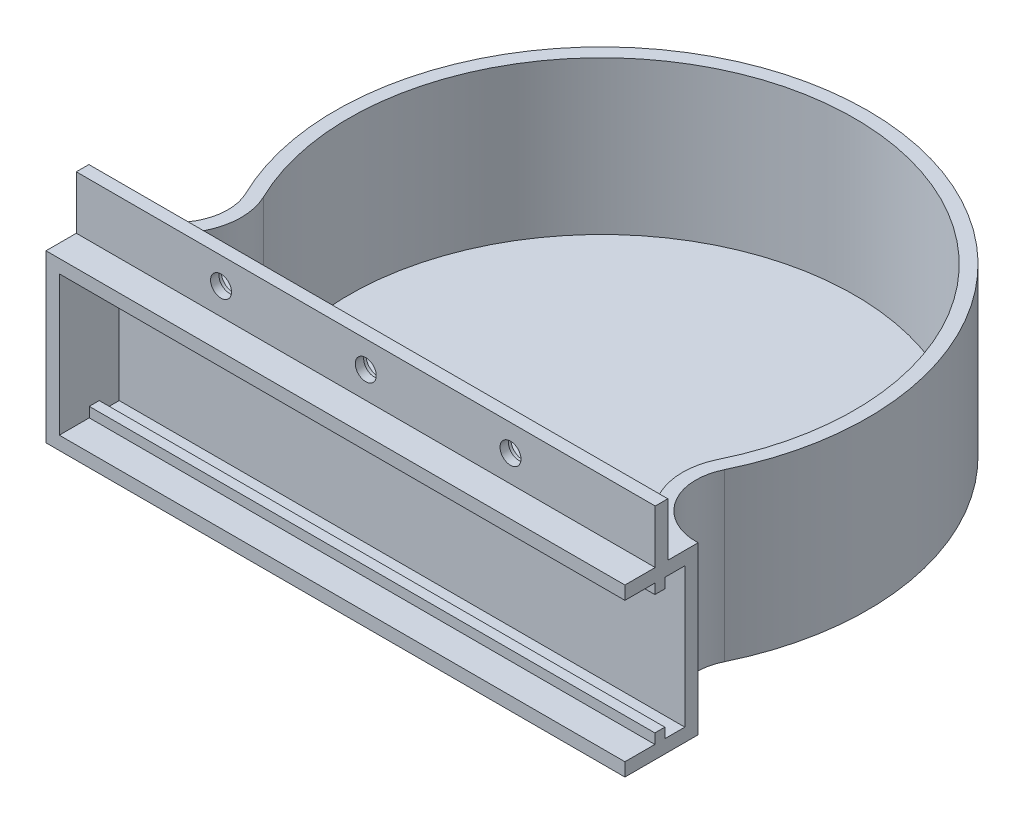
ISO-10303-21;
HEADER;
FILE_DESCRIPTION(('STEP AP214'),'2;1');
FILE_NAME('part.step','',(''),(''),'','','');
FILE_SCHEMA(('AUTOMOTIVE_DESIGN { 1 0 10303 214 1 1 1 1 }'));
ENDSEC;
DATA;
#1=APPLICATION_CONTEXT('core data for automotive mechanical design processes');
#2=APPLICATION_PROTOCOL_DEFINITION('international standard','automotive_design',2000,#1);
#3=PRODUCT_CONTEXT('',#1,'mechanical');
#4=PRODUCT('Part','Part','',(#3));
#5=PRODUCT_RELATED_PRODUCT_CATEGORY('part','',(#4));
#6=PRODUCT_DEFINITION_FORMATION('','',#4);
#7=PRODUCT_DEFINITION_CONTEXT('part definition',#1,'design');
#8=PRODUCT_DEFINITION('design','',#6,#7);
#9=PRODUCT_DEFINITION_SHAPE('','',#8);
#10=(LENGTH_UNIT() NAMED_UNIT(*) SI_UNIT(.MILLI.,.METRE.));
#11=(NAMED_UNIT(*) PLANE_ANGLE_UNIT() SI_UNIT($,.RADIAN.));
#12=(NAMED_UNIT(*) SI_UNIT($,.STERADIAN.) SOLID_ANGLE_UNIT());
#13=UNCERTAINTY_MEASURE_WITH_UNIT(LENGTH_MEASURE(1.E-05),#10,'distance_accuracy_value','');
#14=(GEOMETRIC_REPRESENTATION_CONTEXT(3) GLOBAL_UNCERTAINTY_ASSIGNED_CONTEXT((#13)) GLOBAL_UNIT_ASSIGNED_CONTEXT((#10,
#11,#12)) REPRESENTATION_CONTEXT('',''));
#15=CARTESIAN_POINT('',(0.,0.,0.));
#16=DIRECTION('',(0.,0.,1.));
#17=DIRECTION('',(1.,0.,0.));
#18=AXIS2_PLACEMENT_3D('',#15,#16,#17);
#19=CARTESIAN_POINT('',(0.,0.,-3.175));
#20=DIRECTION('',(0.,0.,-1.));
#21=DIRECTION('',(-1.,0.,0.));
#22=AXIS2_PLACEMENT_3D('',#19,#20,#21);
#23=PLANE('',#22);
#24=DIRECTION('',(1.,0.,0.));
#25=VECTOR('',#24,1.);
#26=CARTESIAN_POINT('',(-69.05625,19.84375,-3.175));
#27=LINE('',#26,#25);
#28=CARTESIAN_POINT('',(-58.9954428893305,19.84375,-3.175));
#29=VERTEX_POINT('',#28);
#30=CARTESIAN_POINT('',(58.9954428893305,19.84375,-3.175));
#31=VERTEX_POINT('',#30);
#32=EDGE_CURVE('E63',#29,#31,#27,.T.);
#33=ORIENTED_EDGE('',*,*,#32,.T.);
#34=DIRECTION('',(0.,-1.,0.));
#35=VECTOR('',#34,1.);
#36=CARTESIAN_POINT('',(58.9954428893305,195.282252847152,-3.175));
#37=LINE('',#36,#35);
#38=CARTESIAN_POINT('',(58.9954428893305,-16.66875,-3.175));
#39=VERTEX_POINT('',#38);
#40=EDGE_CURVE('E541',#31,#39,#37,.T.);
#41=ORIENTED_EDGE('',*,*,#40,.T.);
#42=DIRECTION('',(1.,0.,0.));
#43=VECTOR('',#42,1.);
#44=CARTESIAN_POINT('',(0.,-16.66875,-3.175));
#45=LINE('',#44,#43);
#46=CARTESIAN_POINT('',(-58.9954428893305,-16.66875,-3.175));
#47=VERTEX_POINT('',#46);
#48=EDGE_CURVE('E261',#47,#39,#45,.T.);
#49=ORIENTED_EDGE('',*,*,#48,.F.);
#50=DIRECTION('',(0.,-1.,0.));
#51=VECTOR('',#50,1.);
#52=CARTESIAN_POINT('',(-58.9954428893305,195.282252847152,-3.175));
#53=LINE('',#52,#51);
#54=EDGE_CURVE('E250',#29,#47,#53,.T.);
#55=ORIENTED_EDGE('',*,*,#54,.F.);
#56=EDGE_LOOP('',(#33,#41,#49,#55));
#57=FACE_BOUND('',#56,.T.);
#58=ADVANCED_FACE('F39',(#57),#23,.T.);
#59=DIRECTION('',(0.,1.,0.));
#60=VECTOR('',#59,1.);
#61=CARTESIAN_POINT('',(68.5204428893305,-16.66875,-3.175));
#62=LINE('',#61,#60);
#63=CARTESIAN_POINT('',(68.5204428893305,-19.84375,-3.175));
#64=VERTEX_POINT('',#63);
#65=CARTESIAN_POINT('',(68.5204428893305,19.84375,-3.175));
#66=VERTEX_POINT('',#65);
#67=EDGE_CURVE('E55',#64,#66,#62,.T.);
#68=ORIENTED_EDGE('',*,*,#67,.T.);
#69=CARTESIAN_POINT('',(69.05625,19.84375,-3.175));
#70=VERTEX_POINT('',#69);
#71=EDGE_CURVE('E243',#66,#70,#27,.T.);
#72=ORIENTED_EDGE('',*,*,#71,.T.);
#73=DIRECTION('',(0.,-1.,0.));
#74=VECTOR('',#73,1.);
#75=CARTESIAN_POINT('',(69.05625,19.84375,-3.175));
#76=LINE('',#75,#74);
#77=CARTESIAN_POINT('',(69.05625,-19.84375,-3.175));
#78=VERTEX_POINT('',#77);
#79=EDGE_CURVE('E432',#70,#78,#76,.T.);
#80=ORIENTED_EDGE('',*,*,#79,.T.);
#81=DIRECTION('',(-1.,0.,0.));
#82=VECTOR('',#81,1.);
#83=CARTESIAN_POINT('',(69.05625,-19.84375,-3.175));
#84=LINE('',#83,#82);
#85=EDGE_CURVE('E421',#78,#64,#84,.T.);
#86=ORIENTED_EDGE('',*,*,#85,.T.);
#87=EDGE_LOOP('',(#68,#72,#80,#86));
#88=FACE_BOUND('',#87,.T.);
#89=ADVANCED_FACE('F569',(#88),#23,.T.);
#90=CARTESIAN_POINT('',(-69.05625,19.84375,-3.175));
#91=VERTEX_POINT('',#90);
#92=CARTESIAN_POINT('',(-68.5204428893305,19.84375,-3.175));
#93=VERTEX_POINT('',#92);
#94=EDGE_CURVE('E428',#91,#93,#27,.T.);
#95=ORIENTED_EDGE('',*,*,#94,.T.);
#96=DIRECTION('',(0.,1.,0.));
#97=VECTOR('',#96,1.);
#98=CARTESIAN_POINT('',(-68.5204428893305,-19.84375,-3.175));
#99=LINE('',#98,#97);
#100=CARTESIAN_POINT('',(-68.5204428893305,-19.84375,-3.175));
#101=VERTEX_POINT('',#100);
#102=EDGE_CURVE('E510',#93,#101,#99,.F.);
#103=ORIENTED_EDGE('',*,*,#102,.T.);
#104=CARTESIAN_POINT('',(-69.05625,-19.84375,-3.175));
#105=VERTEX_POINT('',#104);
#106=EDGE_CURVE('E420',#101,#105,#84,.T.);
#107=ORIENTED_EDGE('',*,*,#106,.T.);
#108=DIRECTION('',(0.,1.,0.));
#109=VECTOR('',#108,1.);
#110=CARTESIAN_POINT('',(-69.05625,-19.84375,-3.175));
#111=LINE('',#110,#109);
#112=EDGE_CURVE('E424',#105,#91,#111,.T.);
#113=ORIENTED_EDGE('',*,*,#112,.T.);
#114=EDGE_LOOP('',(#95,#103,#107,#113));
#115=FACE_BOUND('',#114,.T.);
#116=ADVANCED_FACE('F592',(#115),#23,.T.);
#117=CARTESIAN_POINT('',(-65.88125,-16.66875,14.2875));
#118=DIRECTION('',(0.,1.,0.));
#119=DIRECTION('',(0.,0.,1.));
#120=AXIS2_PLACEMENT_3D('',#117,#118,#119);
#121=PLANE('',#120);
#122=ORIENTED_EDGE('',*,*,#48,.T.);
#123=CARTESIAN_POINT('',(68.5204428893305,-16.66875,-15.875));
#124=DIRECTION('',(0.,1.,0.));
#125=DIRECTION('',(0.,0.,1.));
#126=AXIS2_PLACEMENT_3D('',#123,#124,#125);
#127=CIRCLE('',#126,15.875);
#128=CARTESIAN_POINT('',(54.24535062072,-16.66875,-22.8203125));
#129=VERTEX_POINT('',#128);
#130=EDGE_CURVE('E537',#129,#39,#127,.T.);
#131=ORIENTED_EDGE('',*,*,#130,.F.);
#132=CARTESIAN_POINT('',(0.,-16.66875,-49.2125));
#133=DIRECTION('',(0.,-1.,0.));
#134=DIRECTION('',(0.,0.,1.));
#135=AXIS2_PLACEMENT_3D('',#132,#133,#134);
#136=CIRCLE('',#135,60.325);
#137=CARTESIAN_POINT('',(-54.24535062072,-16.66875,-22.8203125));
#138=VERTEX_POINT('',#137);
#139=EDGE_CURVE('E533',#138,#129,#136,.T.);
#140=ORIENTED_EDGE('',*,*,#139,.F.);
#141=CARTESIAN_POINT('',(-68.5204428893305,-16.66875,-15.875));
#142=DIRECTION('',(0.,1.,0.));
#143=DIRECTION('',(0.,0.,1.));
#144=AXIS2_PLACEMENT_3D('',#141,#142,#143);
#145=CIRCLE('',#144,15.875);
#146=EDGE_CURVE('E529',#47,#138,#145,.T.);
#147=ORIENTED_EDGE('',*,*,#146,.F.);
#148=EDGE_LOOP('',(#122,#131,#140,#147));
#149=FACE_BOUND('',#148,.T.);
#150=ADVANCED_FACE('F558',(#149),#121,.T.);
#151=CARTESIAN_POINT('',(0.,26.19375,4.05625));
#152=DIRECTION('',(0.,0.,1.));
#153=DIRECTION('',(1.,0.,0.));
#154=AXIS2_PLACEMENT_3D('',#151,#152,#153);
#155=CYLINDRICAL_SURFACE('',#154,2.5);
#156=CARTESIAN_POINT('',(0.,26.19375,7.05625));
#157=DIRECTION('',(0.,0.,-1.));
#158=DIRECTION('',(-1.,0.,0.));
#159=AXIS2_PLACEMENT_3D('',#156,#157,#158);
#160=CIRCLE('',#159,2.5);
#161=CARTESIAN_POINT('',(-2.5,26.19375,7.05625));
#162=VERTEX_POINT('',#161);
#163=EDGE_CURVE('E300',#162,#162,#160,.T.);
#164=ORIENTED_EDGE('',*,*,#163,.F.);
#165=EDGE_LOOP('',(#164));
#166=FACE_BOUND('',#165,.T.);
#167=CARTESIAN_POINT('',(0.,26.19375,5.05625));
#168=DIRECTION('',(0.,0.,-1.));
#169=DIRECTION('',(-1.,0.,0.));
#170=AXIS2_PLACEMENT_3D('',#167,#168,#169);
#171=CIRCLE('',#170,2.5);
#172=CARTESIAN_POINT('',(-2.5,26.19375,5.05625));
#173=VERTEX_POINT('',#172);
#174=EDGE_CURVE('E296',#173,#173,#171,.T.);
#175=ORIENTED_EDGE('',*,*,#174,.T.);
#176=EDGE_LOOP('',(#175));
#177=FACE_BOUND('',#176,.T.);
#178=ADVANCED_FACE('F696',(#166,#177),#155,.F.);
#179=CARTESIAN_POINT('',(34.528125,26.19375,4.05625));
#180=DIRECTION('',(0.,0.,1.));
#181=DIRECTION('',(1.,0.,0.));
#182=AXIS2_PLACEMENT_3D('',#179,#180,#181);
#183=CYLINDRICAL_SURFACE('',#182,2.5);
#184=CARTESIAN_POINT('',(34.528125,26.19375,7.05625));
#185=DIRECTION('',(0.,0.,-1.));
#186=DIRECTION('',(-1.,0.,0.));
#187=AXIS2_PLACEMENT_3D('',#184,#185,#186);
#188=CIRCLE('',#187,2.5);
#189=CARTESIAN_POINT('',(32.028125,26.19375,7.05625));
#190=VERTEX_POINT('',#189);
#191=EDGE_CURVE('E295',#190,#190,#188,.T.);
#192=ORIENTED_EDGE('',*,*,#191,.F.);
#193=EDGE_LOOP('',(#192));
#194=FACE_BOUND('',#193,.T.);
#195=CARTESIAN_POINT('',(34.528125,26.19375,5.05625));
#196=DIRECTION('',(0.,0.,-1.));
#197=DIRECTION('',(-1.,0.,0.));
#198=AXIS2_PLACEMENT_3D('',#195,#196,#197);
#199=CIRCLE('',#198,2.5);
#200=CARTESIAN_POINT('',(32.028125,26.19375,5.05625));
#201=VERTEX_POINT('',#200);
#202=EDGE_CURVE('E499',#201,#201,#199,.T.);
#203=ORIENTED_EDGE('',*,*,#202,.T.);
#204=EDGE_LOOP('',(#203));
#205=FACE_BOUND('',#204,.T.);
#206=ADVANCED_FACE('F701',(#194,#205),#183,.F.);
#207=CARTESIAN_POINT('',(-34.528125,26.19375,4.05625));
#208=DIRECTION('',(0.,0.,1.));
#209=DIRECTION('',(1.,0.,0.));
#210=AXIS2_PLACEMENT_3D('',#207,#208,#209);
#211=CYLINDRICAL_SURFACE('',#210,2.5);
#212=CARTESIAN_POINT('',(-34.528125,26.19375,7.05625));
#213=DIRECTION('',(0.,0.,-1.));
#214=DIRECTION('',(-1.,0.,0.));
#215=AXIS2_PLACEMENT_3D('',#212,#213,#214);
#216=CIRCLE('',#215,2.5);
#217=CARTESIAN_POINT('',(-37.028125,26.19375,7.05625));
#218=VERTEX_POINT('',#217);
#219=EDGE_CURVE('E291',#218,#218,#216,.T.);
#220=ORIENTED_EDGE('',*,*,#219,.F.);
#221=EDGE_LOOP('',(#220));
#222=FACE_BOUND('',#221,.T.);
#223=CARTESIAN_POINT('',(-34.528125,26.19375,5.05625));
#224=DIRECTION('',(0.,0.,-1.));
#225=DIRECTION('',(-1.,0.,0.));
#226=AXIS2_PLACEMENT_3D('',#223,#224,#225);
#227=CIRCLE('',#226,2.5);
#228=CARTESIAN_POINT('',(-37.028125,26.19375,5.05625));
#229=VERTEX_POINT('',#228);
#230=EDGE_CURVE('E271',#229,#229,#227,.T.);
#231=ORIENTED_EDGE('',*,*,#230,.T.);
#232=EDGE_LOOP('',(#231));
#233=FACE_BOUND('',#232,.T.);
#234=ADVANCED_FACE('F731',(#222,#233),#211,.F.);
#235=CARTESIAN_POINT('',(-69.05625,19.84375,14.2875));
#236=DIRECTION('',(0.,-1.,0.));
#237=DIRECTION('',(1.,0.,0.));
#238=AXIS2_PLACEMENT_3D('',#235,#236,#237);
#239=PLANE('',#238);
#240=CARTESIAN_POINT('',(68.5204428893305,19.84375,-15.875));
#241=DIRECTION('',(0.,-1.,0.));
#242=DIRECTION('',(1.,0.,0.));
#243=AXIS2_PLACEMENT_3D('',#240,#241,#242);
#244=CIRCLE('',#243,15.875);
#245=CARTESIAN_POINT('',(54.24535062072,19.84375,-22.8203125));
#246=VERTEX_POINT('',#245);
#247=EDGE_CURVE('E245',#31,#246,#244,.T.);
#248=ORIENTED_EDGE('',*,*,#247,.F.);
#249=ORIENTED_EDGE('',*,*,#32,.F.);
#250=CARTESIAN_POINT('',(-68.5204428893305,19.84375,-15.875));
#251=DIRECTION('',(0.,-1.,0.));
#252=DIRECTION('',(1.,0.,0.));
#253=AXIS2_PLACEMENT_3D('',#250,#251,#252);
#254=CIRCLE('',#253,15.875);
#255=CARTESIAN_POINT('',(-54.24535062072,19.84375,-22.8203125));
#256=VERTEX_POINT('',#255);
#257=EDGE_CURVE('E521',#256,#29,#254,.T.);
#258=ORIENTED_EDGE('',*,*,#257,.F.);
#259=CARTESIAN_POINT('',(0.,19.84375,-49.2125));
#260=DIRECTION('',(0.,-1.,0.));
#261=DIRECTION('',(1.,0.,0.));
#262=AXIS2_PLACEMENT_3D('',#259,#260,#261);
#263=CIRCLE('',#262,60.325);
#264=EDGE_CURVE('E525',#246,#256,#263,.F.);
#265=ORIENTED_EDGE('',*,*,#264,.F.);
#266=EDGE_LOOP('',(#248,#249,#258,#265));
#267=FACE_BOUND('',#266,.T.);
#268=DIRECTION('',(-1.,0.,0.));
#269=VECTOR('',#268,1.);
#270=CARTESIAN_POINT('',(69.05625,19.84375,4.05625));
#271=LINE('',#270,#269);
#272=CARTESIAN_POINT('',(69.05625,19.84375,4.05625));
#273=VERTEX_POINT('',#272);
#274=CARTESIAN_POINT('',(-69.05625,19.84375,4.05625));
#275=VERTEX_POINT('',#274);
#276=EDGE_CURVE('E309',#273,#275,#271,.T.);
#277=ORIENTED_EDGE('',*,*,#276,.F.);
#278=DIRECTION('',(0.,0.,-1.));
#279=VECTOR('',#278,1.);
#280=CARTESIAN_POINT('',(69.05625,19.84375,14.2875));
#281=LINE('',#280,#279);
#282=EDGE_CURVE('E486',#273,#70,#281,.T.);
#283=ORIENTED_EDGE('',*,*,#282,.T.);
#284=ORIENTED_EDGE('',*,*,#71,.F.);
#285=CARTESIAN_POINT('',(68.5204428893305,19.84375,-15.875));
#286=DIRECTION('',(0.,-1.,0.));
#287=DIRECTION('',(1.,0.,0.));
#288=AXIS2_PLACEMENT_3D('',#285,#286,#287);
#289=CIRCLE('',#288,12.7);
#290=CARTESIAN_POINT('',(57.1003690744421,19.84375,-21.43125));
#291=VERTEX_POINT('',#290);
#292=EDGE_CURVE('E227',#291,#66,#289,.F.);
#293=ORIENTED_EDGE('',*,*,#292,.F.);
#294=CARTESIAN_POINT('',(0.,19.84375,-49.2125));
#295=DIRECTION('',(0.,-1.,0.));
#296=DIRECTION('',(1.,0.,0.));
#297=AXIS2_PLACEMENT_3D('',#294,#295,#296);
#298=CIRCLE('',#297,63.5);
#299=CARTESIAN_POINT('',(-57.1003690744421,19.84375,-21.43125));
#300=VERTEX_POINT('',#299);
#301=EDGE_CURVE('E240',#300,#291,#298,.T.);
#302=ORIENTED_EDGE('',*,*,#301,.F.);
#303=CARTESIAN_POINT('',(-68.5204428893305,19.84375,-15.875));
#304=DIRECTION('',(0.,-1.,0.));
#305=DIRECTION('',(1.,0.,0.));
#306=AXIS2_PLACEMENT_3D('',#303,#304,#305);
#307=CIRCLE('',#306,12.7);
#308=EDGE_CURVE('E262',#93,#300,#307,.F.);
#309=ORIENTED_EDGE('',*,*,#308,.F.);
#310=ORIENTED_EDGE('',*,*,#94,.F.);
#311=DIRECTION('',(0.,0.,-1.));
#312=VECTOR('',#311,1.);
#313=CARTESIAN_POINT('',(-69.05625,19.84375,14.2875));
#314=LINE('',#313,#312);
#315=EDGE_CURVE('E481',#275,#91,#314,.T.);
#316=ORIENTED_EDGE('',*,*,#315,.F.);
#317=EDGE_LOOP('',(#277,#283,#284,#293,#302,#309,#310,#316));
#318=FACE_BOUND('',#317,.T.);
#319=ADVANCED_FACE('F238',(#267,#318),#239,.F.);
#320=CARTESIAN_POINT('',(-65.88125,16.66875,14.2875));
#321=DIRECTION('',(0.,-1.,0.));
#322=DIRECTION('',(1.,0.,0.));
#323=AXIS2_PLACEMENT_3D('',#320,#321,#322);
#324=PLANE('',#323);
#325=DIRECTION('',(1.,0.,0.));
#326=VECTOR('',#325,1.);
#327=CARTESIAN_POINT('',(-69.05825,16.66875,4.7625));
#328=LINE('',#327,#326);
#329=CARTESIAN_POINT('',(-65.88125,16.66875,4.7625));
#330=VERTEX_POINT('',#329);
#331=CARTESIAN_POINT('',(69.05625,16.66875,4.7625));
#332=VERTEX_POINT('',#331);
#333=EDGE_CURVE('E359',#330,#332,#328,.T.);
#334=ORIENTED_EDGE('',*,*,#333,.F.);
#335=DIRECTION('',(0.,0.,-1.));
#336=VECTOR('',#335,1.);
#337=CARTESIAN_POINT('',(-65.88125,16.66875,14.2875));
#338=LINE('',#337,#336);
#339=CARTESIAN_POINT('',(-65.88125,16.66875,0.));
#340=VERTEX_POINT('',#339);
#341=EDGE_CURVE('E447',#330,#340,#338,.T.);
#342=ORIENTED_EDGE('',*,*,#341,.T.);
#343=DIRECTION('',(-1.,0.,0.));
#344=VECTOR('',#343,1.);
#345=CARTESIAN_POINT('',(-65.88125,16.66875,0.));
#346=LINE('',#345,#344);
#347=CARTESIAN_POINT('',(69.05625,16.66875,0.));
#348=VERTEX_POINT('',#347);
#349=EDGE_CURVE('E441',#348,#340,#346,.T.);
#350=ORIENTED_EDGE('',*,*,#349,.F.);
#351=DIRECTION('',(0.,0.,1.));
#352=VECTOR('',#351,1.);
#353=CARTESIAN_POINT('',(69.05625,16.66875,0.));
#354=LINE('',#353,#352);
#355=EDGE_CURVE('E417',#348,#332,#354,.T.);
#356=ORIENTED_EDGE('',*,*,#355,.T.);
#357=EDGE_LOOP('',(#334,#342,#350,#356));
#358=FACE_BOUND('',#357,.T.);
#359=ADVANCED_FACE('F618',(#358),#324,.T.);
#360=CARTESIAN_POINT('',(-65.88125,-16.66875,14.2875));
#361=DIRECTION('',(0.,1.,0.));
#362=DIRECTION('',(0.,0.,1.));
#363=AXIS2_PLACEMENT_3D('',#360,#361,#362);
#364=PLANE('',#363);
#365=DIRECTION('',(1.,0.,0.));
#366=VECTOR('',#365,1.);
#367=CARTESIAN_POINT('',(-69.05825,-16.66875,4.7625));
#368=LINE('',#367,#366);
#369=CARTESIAN_POINT('',(-65.88125,-16.66875,4.7625));
#370=VERTEX_POINT('',#369);
#371=CARTESIAN_POINT('',(69.05625,-16.66875,4.7625));
#372=VERTEX_POINT('',#371);
#373=EDGE_CURVE('E392',#370,#372,#368,.T.);
#374=ORIENTED_EDGE('',*,*,#373,.T.);
#375=DIRECTION('',(0.,0.,-1.));
#376=VECTOR('',#375,1.);
#377=CARTESIAN_POINT('',(69.05625,-16.66875,14.2875));
#378=LINE('',#377,#376);
#379=CARTESIAN_POINT('',(69.05625,-16.66875,0.));
#380=VERTEX_POINT('',#379);
#381=EDGE_CURVE('E402',#372,#380,#378,.T.);
#382=ORIENTED_EDGE('',*,*,#381,.T.);
#383=DIRECTION('',(1.,0.,0.));
#384=VECTOR('',#383,1.);
#385=CARTESIAN_POINT('',(-65.88125,-16.66875,0.));
#386=LINE('',#385,#384);
#387=CARTESIAN_POINT('',(-65.88125,-16.66875,0.));
#388=VERTEX_POINT('',#387);
#389=EDGE_CURVE('E451',#388,#380,#386,.T.);
#390=ORIENTED_EDGE('',*,*,#389,.F.);
#391=DIRECTION('',(0.,0.,-1.));
#392=VECTOR('',#391,1.);
#393=CARTESIAN_POINT('',(-65.88125,-16.66875,14.2875));
#394=LINE('',#393,#392);
#395=EDGE_CURVE('E461',#370,#388,#394,.T.);
#396=ORIENTED_EDGE('',*,*,#395,.F.);
#397=EDGE_LOOP('',(#374,#382,#390,#396));
#398=FACE_BOUND('',#397,.T.);
#399=ADVANCED_FACE('F668',(#398),#364,.T.);
#400=CARTESIAN_POINT('',(0.,0.,14.2875));
#401=DIRECTION('',(0.,0.,-1.));
#402=DIRECTION('',(-1.,0.,0.));
#403=AXIS2_PLACEMENT_3D('',#400,#401,#402);
#404=PLANE('',#403);
#405=DIRECTION('',(0.,1.,0.));
#406=VECTOR('',#405,1.);
#407=CARTESIAN_POINT('',(69.05625,-19.84375,14.2875));
#408=LINE('',#407,#406);
#409=CARTESIAN_POINT('',(69.05625,-19.84375,14.2875));
#410=VERTEX_POINT('',#409);
#411=CARTESIAN_POINT('',(69.05625,-16.66875,14.2875));
#412=VERTEX_POINT('',#411);
#413=EDGE_CURVE('E474',#410,#412,#408,.T.);
#414=ORIENTED_EDGE('',*,*,#413,.T.);
#415=DIRECTION('',(1.,0.,0.));
#416=VECTOR('',#415,1.);
#417=CARTESIAN_POINT('',(-65.88125,-16.66875,14.2875));
#418=LINE('',#417,#416);
#419=CARTESIAN_POINT('',(-65.88125,-16.66875,14.2875));
#420=VERTEX_POINT('',#419);
#421=EDGE_CURVE('E440',#420,#412,#418,.T.);
#422=ORIENTED_EDGE('',*,*,#421,.F.);
#423=DIRECTION('',(0.,-1.,0.));
#424=VECTOR('',#423,1.);
#425=CARTESIAN_POINT('',(-65.88125,-16.66875,14.2875));
#426=LINE('',#425,#424);
#427=CARTESIAN_POINT('',(-65.88125,16.66875,14.2875));
#428=VERTEX_POINT('',#427);
#429=EDGE_CURVE('E437',#428,#420,#426,.T.);
#430=ORIENTED_EDGE('',*,*,#429,.F.);
#431=DIRECTION('',(-1.,0.,0.));
#432=VECTOR('',#431,1.);
#433=CARTESIAN_POINT('',(-65.88125,16.66875,14.2875));
#434=LINE('',#433,#432);
#435=CARTESIAN_POINT('',(69.05625,16.66875,14.2875));
#436=VERTEX_POINT('',#435);
#437=EDGE_CURVE('E444',#436,#428,#434,.T.);
#438=ORIENTED_EDGE('',*,*,#437,.F.);
#439=CARTESIAN_POINT('',(69.05625,19.84375,14.2875));
#440=VERTEX_POINT('',#439);
#441=EDGE_CURVE('E473',#436,#440,#408,.T.);
#442=ORIENTED_EDGE('',*,*,#441,.T.);
#443=DIRECTION('',(-1.,0.,0.));
#444=VECTOR('',#443,1.);
#445=CARTESIAN_POINT('',(-69.05625,19.84375,14.2875));
#446=LINE('',#445,#444);
#447=CARTESIAN_POINT('',(-69.05625,19.84375,14.2875));
#448=VERTEX_POINT('',#447);
#449=EDGE_CURVE('E478',#440,#448,#446,.T.);
#450=ORIENTED_EDGE('',*,*,#449,.T.);
#451=DIRECTION('',(0.,-1.,0.));
#452=VECTOR('',#451,1.);
#453=CARTESIAN_POINT('',(-69.05625,-19.84375,14.2875));
#454=LINE('',#453,#452);
#455=CARTESIAN_POINT('',(-69.05625,-19.84375,14.2875));
#456=VERTEX_POINT('',#455);
#457=EDGE_CURVE('E466',#448,#456,#454,.T.);
#458=ORIENTED_EDGE('',*,*,#457,.T.);
#459=DIRECTION('',(1.,0.,0.));
#460=VECTOR('',#459,1.);
#461=CARTESIAN_POINT('',(-69.05625,-19.84375,14.2875));
#462=LINE('',#461,#460);
#463=EDGE_CURVE('E470',#456,#410,#462,.T.);
#464=ORIENTED_EDGE('',*,*,#463,.T.);
#465=EDGE_LOOP('',(#414,#422,#430,#438,#442,#450,#458,#464));
#466=FACE_BOUND('',#465,.T.);
#467=ADVANCED_FACE('F585',(#466),#404,.F.);
#468=CARTESIAN_POINT('',(-69.05625,-19.84375,14.2875));
#469=DIRECTION('',(1.,0.,0.));
#470=DIRECTION('',(0.,0.,-1.));
#471=AXIS2_PLACEMENT_3D('',#468,#469,#470);
#472=PLANE('',#471);
#473=CARTESIAN_POINT('',(-69.05625,19.84375,7.05625));
#474=VERTEX_POINT('',#473);
#475=EDGE_CURVE('E482',#448,#474,#314,.T.);
#476=ORIENTED_EDGE('',*,*,#475,.T.);
#477=DIRECTION('',(0.,1.,0.));
#478=VECTOR('',#477,1.);
#479=CARTESIAN_POINT('',(-69.05625,19.84375,7.05625));
#480=LINE('',#479,#478);
#481=CARTESIAN_POINT('',(-69.05625,32.54375,7.05625));
#482=VERTEX_POINT('',#481);
#483=EDGE_CURVE('E327',#474,#482,#480,.T.);
#484=ORIENTED_EDGE('',*,*,#483,.T.);
#485=DIRECTION('',(0.,0.,1.));
#486=VECTOR('',#485,1.);
#487=CARTESIAN_POINT('',(-69.05625,32.54375,4.05625));
#488=LINE('',#487,#486);
#489=CARTESIAN_POINT('',(-69.05625,32.54375,4.05625));
#490=VERTEX_POINT('',#489);
#491=EDGE_CURVE('E335',#490,#482,#488,.T.);
#492=ORIENTED_EDGE('',*,*,#491,.F.);
#493=DIRECTION('',(0.,1.,0.));
#494=VECTOR('',#493,1.);
#495=CARTESIAN_POINT('',(-69.05625,19.84375,4.05625));
#496=LINE('',#495,#494);
#497=EDGE_CURVE('E314',#275,#490,#496,.T.);
#498=ORIENTED_EDGE('',*,*,#497,.F.);
#499=ORIENTED_EDGE('',*,*,#315,.T.);
#500=ORIENTED_EDGE('',*,*,#112,.F.);
#501=DIRECTION('',(0.,0.,-1.));
#502=VECTOR('',#501,1.);
#503=CARTESIAN_POINT('',(-69.05625,-19.84375,14.2875));
#504=LINE('',#503,#502);
#505=EDGE_CURVE('E234',#456,#105,#504,.T.);
#506=ORIENTED_EDGE('',*,*,#505,.F.);
#507=ORIENTED_EDGE('',*,*,#457,.F.);
#508=EDGE_LOOP('',(#476,#484,#492,#498,#499,#500,#506,#507));
#509=FACE_BOUND('',#508,.T.);
#510=ADVANCED_FACE('F589',(#509),#472,.F.);
#511=CARTESIAN_POINT('',(-69.05625,-19.84375,14.2875));
#512=DIRECTION('',(0.,1.,0.));
#513=DIRECTION('',(0.,0.,1.));
#514=AXIS2_PLACEMENT_3D('',#511,#512,#513);
#515=PLANE('',#514);
#516=ORIENTED_EDGE('',*,*,#106,.F.);
#517=CARTESIAN_POINT('',(-68.5204428893305,-19.84375,-15.875));
#518=DIRECTION('',(0.,1.,0.));
#519=DIRECTION('',(0.,0.,1.));
#520=AXIS2_PLACEMENT_3D('',#517,#518,#519);
#521=CIRCLE('',#520,12.7);
#522=CARTESIAN_POINT('',(-57.1003690744421,-19.84375,-21.43125));
#523=VERTEX_POINT('',#522);
#524=EDGE_CURVE('E48',#101,#523,#521,.T.);
#525=ORIENTED_EDGE('',*,*,#524,.T.);
#526=CARTESIAN_POINT('',(0.,-19.84375,-49.2125));
#527=DIRECTION('',(0.,-1.,0.));
#528=DIRECTION('',(0.,0.,-1.));
#529=AXIS2_PLACEMENT_3D('',#526,#527,#528);
#530=CIRCLE('',#529,63.5);
#531=CARTESIAN_POINT('',(57.1003690744421,-19.84375,-21.43125));
#532=VERTEX_POINT('',#531);
#533=EDGE_CURVE('E258',#523,#532,#530,.T.);
#534=ORIENTED_EDGE('',*,*,#533,.T.);
#535=CARTESIAN_POINT('',(68.5204428893305,-19.84375,-15.875));
#536=DIRECTION('',(0.,1.,0.));
#537=DIRECTION('',(0.,0.,1.));
#538=AXIS2_PLACEMENT_3D('',#535,#536,#537);
#539=CIRCLE('',#538,12.7);
#540=EDGE_CURVE('E11',#532,#64,#539,.T.);
#541=ORIENTED_EDGE('',*,*,#540,.T.);
#542=ORIENTED_EDGE('',*,*,#85,.F.);
#543=DIRECTION('',(0.,0.,-1.));
#544=VECTOR('',#543,1.);
#545=CARTESIAN_POINT('',(69.05625,-19.84375,14.2875));
#546=LINE('',#545,#544);
#547=EDGE_CURVE('E490',#410,#78,#546,.T.);
#548=ORIENTED_EDGE('',*,*,#547,.F.);
#549=ORIENTED_EDGE('',*,*,#463,.F.);
#550=ORIENTED_EDGE('',*,*,#505,.T.);
#551=EDGE_LOOP('',(#516,#525,#534,#541,#542,#548,#549,#550));
#552=FACE_BOUND('',#551,.T.);
#553=ADVANCED_FACE('F516',(#552),#515,.F.);
#554=CARTESIAN_POINT('',(69.05625,-19.84375,14.2875));
#555=DIRECTION('',(-1.,0.,0.));
#556=DIRECTION('',(0.,-1.,0.));
#557=AXIS2_PLACEMENT_3D('',#554,#555,#556);
#558=PLANE('',#557);
#559=ORIENTED_EDGE('',*,*,#441,.F.);
#560=CARTESIAN_POINT('',(69.05625,16.66875,7.14375));
#561=VERTEX_POINT('',#560);
#562=EDGE_CURVE('E416',#561,#436,#354,.T.);
#563=ORIENTED_EDGE('',*,*,#562,.F.);
#564=DIRECTION('',(0.,-1.,0.));
#565=VECTOR('',#564,1.);
#566=CARTESIAN_POINT('',(69.05625,16.66875,7.14375));
#567=LINE('',#566,#565);
#568=CARTESIAN_POINT('',(69.05625,14.2875,7.14375));
#569=VERTEX_POINT('',#568);
#570=EDGE_CURVE('E339',#561,#569,#567,.T.);
#571=ORIENTED_EDGE('',*,*,#570,.T.);
#572=DIRECTION('',(0.,0.,-1.));
#573=VECTOR('',#572,1.);
#574=CARTESIAN_POINT('',(69.05625,14.2875,7.14375));
#575=LINE('',#574,#573);
#576=CARTESIAN_POINT('',(69.05625,14.2875,4.7625));
#577=VERTEX_POINT('',#576);
#578=EDGE_CURVE('E340',#569,#577,#575,.T.);
#579=ORIENTED_EDGE('',*,*,#578,.T.);
#580=DIRECTION('',(0.,1.,0.));
#581=VECTOR('',#580,1.);
#582=CARTESIAN_POINT('',(69.05625,16.66875,4.7625));
#583=LINE('',#582,#581);
#584=EDGE_CURVE('E344',#577,#332,#583,.T.);
#585=ORIENTED_EDGE('',*,*,#584,.T.);
#586=ORIENTED_EDGE('',*,*,#355,.F.);
#587=DIRECTION('',(0.,1.,0.));
#588=VECTOR('',#587,1.);
#589=CARTESIAN_POINT('',(69.05625,-16.66875,0.));
#590=LINE('',#589,#588);
#591=EDGE_CURVE('E412',#380,#348,#590,.T.);
#592=ORIENTED_EDGE('',*,*,#591,.F.);
#593=ORIENTED_EDGE('',*,*,#381,.F.);
#594=DIRECTION('',(0.,1.,0.));
#595=VECTOR('',#594,1.);
#596=CARTESIAN_POINT('',(69.05625,-16.66875,4.7625));
#597=LINE('',#596,#595);
#598=CARTESIAN_POINT('',(69.05625,-14.2875,4.7625));
#599=VERTEX_POINT('',#598);
#600=EDGE_CURVE('E375',#372,#599,#597,.T.);
#601=ORIENTED_EDGE('',*,*,#600,.T.);
#602=DIRECTION('',(0.,0.,1.));
#603=VECTOR('',#602,1.);
#604=CARTESIAN_POINT('',(69.05625,-14.2875,7.14375));
#605=LINE('',#604,#603);
#606=CARTESIAN_POINT('',(69.05625,-14.2875,7.14375));
#607=VERTEX_POINT('',#606);
#608=EDGE_CURVE('E380',#599,#607,#605,.T.);
#609=ORIENTED_EDGE('',*,*,#608,.T.);
#610=DIRECTION('',(0.,-1.,0.));
#611=VECTOR('',#610,1.);
#612=CARTESIAN_POINT('',(69.05625,-16.66875,7.14375));
#613=LINE('',#612,#611);
#614=CARTESIAN_POINT('',(69.05625,-16.66875,7.14375));
#615=VERTEX_POINT('',#614);
#616=EDGE_CURVE('E369',#607,#615,#613,.T.);
#617=ORIENTED_EDGE('',*,*,#616,.T.);
#618=EDGE_CURVE('E408',#412,#615,#378,.T.);
#619=ORIENTED_EDGE('',*,*,#618,.F.);
#620=ORIENTED_EDGE('',*,*,#413,.F.);
#621=ORIENTED_EDGE('',*,*,#547,.T.);
#622=ORIENTED_EDGE('',*,*,#79,.F.);
#623=ORIENTED_EDGE('',*,*,#282,.F.);
#624=DIRECTION('',(0.,-1.,0.));
#625=VECTOR('',#624,1.);
#626=CARTESIAN_POINT('',(69.05625,19.84375,4.05625));
#627=LINE('',#626,#625);
#628=CARTESIAN_POINT('',(69.05625,32.54375,4.05625));
#629=VERTEX_POINT('',#628);
#630=EDGE_CURVE('E305',#629,#273,#627,.T.);
#631=ORIENTED_EDGE('',*,*,#630,.F.);
#632=DIRECTION('',(0.,0.,1.));
#633=VECTOR('',#632,1.);
#634=CARTESIAN_POINT('',(69.05625,32.54375,4.05625));
#635=LINE('',#634,#633);
#636=CARTESIAN_POINT('',(69.05625,32.54375,7.05625));
#637=VERTEX_POINT('',#636);
#638=EDGE_CURVE('E320',#629,#637,#635,.T.);
#639=ORIENTED_EDGE('',*,*,#638,.T.);
#640=DIRECTION('',(0.,-1.,0.));
#641=VECTOR('',#640,1.);
#642=CARTESIAN_POINT('',(69.05625,19.84375,7.05625));
#643=LINE('',#642,#641);
#644=CARTESIAN_POINT('',(69.05625,19.84375,7.05625));
#645=VERTEX_POINT('',#644);
#646=EDGE_CURVE('E304',#637,#645,#643,.T.);
#647=ORIENTED_EDGE('',*,*,#646,.T.);
#648=EDGE_CURVE('E487',#440,#645,#281,.T.);
#649=ORIENTED_EDGE('',*,*,#648,.F.);
#650=EDGE_LOOP('',(#559,#563,#571,#579,#585,#586,#592,#593,#601,#609,#617,#619,#620,#621,#622,
#623,#631,#639,#647,#649));
#651=FACE_BOUND('',#650,.T.);
#652=ADVANCED_FACE('F577',(#651),#558,.F.);
#653=ORIENTED_EDGE('',*,*,#648,.T.);
#654=DIRECTION('',(-1.,0.,0.));
#655=VECTOR('',#654,1.);
#656=CARTESIAN_POINT('',(69.05625,19.84375,7.05625));
#657=LINE('',#656,#655);
#658=EDGE_CURVE('E324',#645,#474,#657,.T.);
#659=ORIENTED_EDGE('',*,*,#658,.T.);
#660=ORIENTED_EDGE('',*,*,#475,.F.);
#661=ORIENTED_EDGE('',*,*,#449,.F.);
#662=EDGE_LOOP('',(#653,#659,#660,#661));
#663=FACE_BOUND('',#662,.T.);
#664=ADVANCED_FACE('F610',(#663),#239,.F.);
#665=CARTESIAN_POINT('',(-65.88125,-16.66875,14.2875));
#666=DIRECTION('',(1.,0.,0.));
#667=DIRECTION('',(0.,0.,-1.));
#668=AXIS2_PLACEMENT_3D('',#665,#666,#667);
#669=PLANE('',#668);
#670=DIRECTION('',(0.,-1.,0.));
#671=VECTOR('',#670,1.);
#672=CARTESIAN_POINT('',(-65.88125,16.66875,4.7625));
#673=LINE('',#672,#671);
#674=CARTESIAN_POINT('',(-65.88125,14.2875,4.7625));
#675=VERTEX_POINT('',#674);
#676=EDGE_CURVE('E366',#330,#675,#673,.T.);
#677=ORIENTED_EDGE('',*,*,#676,.T.);
#678=DIRECTION('',(0.,0.,1.));
#679=VECTOR('',#678,1.);
#680=CARTESIAN_POINT('',(-65.88125,14.2875,7.14375));
#681=LINE('',#680,#679);
#682=CARTESIAN_POINT('',(-65.88125,14.2875,7.14375));
#683=VERTEX_POINT('',#682);
#684=EDGE_CURVE('E370',#675,#683,#681,.T.);
#685=ORIENTED_EDGE('',*,*,#684,.T.);
#686=DIRECTION('',(0.,1.,0.));
#687=VECTOR('',#686,1.);
#688=CARTESIAN_POINT('',(-65.88125,16.66875,7.14375));
#689=LINE('',#688,#687);
#690=CARTESIAN_POINT('',(-65.88125,16.66875,7.14375));
#691=VERTEX_POINT('',#690);
#692=EDGE_CURVE('E355',#683,#691,#689,.T.);
#693=ORIENTED_EDGE('',*,*,#692,.T.);
#694=EDGE_CURVE('E457',#428,#691,#338,.T.);
#695=ORIENTED_EDGE('',*,*,#694,.F.);
#696=ORIENTED_EDGE('',*,*,#429,.T.);
#697=CARTESIAN_POINT('',(-65.88125,-16.66875,7.14375));
#698=VERTEX_POINT('',#697);
#699=EDGE_CURVE('E462',#420,#698,#394,.T.);
#700=ORIENTED_EDGE('',*,*,#699,.T.);
#701=DIRECTION('',(0.,1.,0.));
#702=VECTOR('',#701,1.);
#703=CARTESIAN_POINT('',(-65.88125,-16.66875,7.14375));
#704=LINE('',#703,#702);
#705=CARTESIAN_POINT('',(-65.88125,-14.2875,7.14375));
#706=VERTEX_POINT('',#705);
#707=EDGE_CURVE('E398',#698,#706,#704,.T.);
#708=ORIENTED_EDGE('',*,*,#707,.T.);
#709=DIRECTION('',(0.,0.,-1.));
#710=VECTOR('',#709,1.);
#711=CARTESIAN_POINT('',(-65.88125,-14.2875,7.14375));
#712=LINE('',#711,#710);
#713=CARTESIAN_POINT('',(-65.88125,-14.2875,4.7625));
#714=VERTEX_POINT('',#713);
#715=EDGE_CURVE('E399',#706,#714,#712,.T.);
#716=ORIENTED_EDGE('',*,*,#715,.T.);
#717=DIRECTION('',(0.,-1.,0.));
#718=VECTOR('',#717,1.);
#719=CARTESIAN_POINT('',(-65.88125,-16.66875,4.7625));
#720=LINE('',#719,#718);
#721=EDGE_CURVE('E403',#714,#370,#720,.T.);
#722=ORIENTED_EDGE('',*,*,#721,.T.);
#723=ORIENTED_EDGE('',*,*,#395,.T.);
#724=DIRECTION('',(0.,-1.,0.));
#725=VECTOR('',#724,1.);
#726=CARTESIAN_POINT('',(-65.88125,-16.66875,0.));
#727=LINE('',#726,#725);
#728=EDGE_CURVE('E436',#340,#388,#727,.T.);
#729=ORIENTED_EDGE('',*,*,#728,.F.);
#730=ORIENTED_EDGE('',*,*,#341,.F.);
#731=EDGE_LOOP('',(#677,#685,#693,#695,#696,#700,#708,#716,#722,#723,#729,#730));
#732=FACE_BOUND('',#731,.T.);
#733=ADVANCED_FACE('F621',(#732),#669,.T.);
#734=ORIENTED_EDGE('',*,*,#421,.T.);
#735=ORIENTED_EDGE('',*,*,#618,.T.);
#736=DIRECTION('',(1.,0.,0.));
#737=VECTOR('',#736,1.);
#738=CARTESIAN_POINT('',(-69.05825,-16.66875,7.14375));
#739=LINE('',#738,#737);
#740=EDGE_CURVE('E395',#698,#615,#739,.T.);
#741=ORIENTED_EDGE('',*,*,#740,.F.);
#742=ORIENTED_EDGE('',*,*,#699,.F.);
#743=EDGE_LOOP('',(#734,#735,#741,#742));
#744=FACE_BOUND('',#743,.T.);
#745=ADVANCED_FACE('F652',(#744),#364,.T.);
#746=DIRECTION('',(1.,0.,0.));
#747=VECTOR('',#746,1.);
#748=CARTESIAN_POINT('',(-69.05825,16.66875,7.14375));
#749=LINE('',#748,#747);
#750=EDGE_CURVE('E351',#691,#561,#749,.T.);
#751=ORIENTED_EDGE('',*,*,#750,.T.);
#752=ORIENTED_EDGE('',*,*,#562,.T.);
#753=ORIENTED_EDGE('',*,*,#437,.T.);
#754=ORIENTED_EDGE('',*,*,#694,.T.);
#755=EDGE_LOOP('',(#751,#752,#753,#754));
#756=FACE_BOUND('',#755,.T.);
#757=ADVANCED_FACE('F647',(#756),#324,.T.);
#758=CARTESIAN_POINT('',(0.,0.,0.));
#759=DIRECTION('',(0.,0.,-1.));
#760=DIRECTION('',(-1.,0.,0.));
#761=AXIS2_PLACEMENT_3D('',#758,#759,#760);
#762=PLANE('',#761);
#763=ORIENTED_EDGE('',*,*,#389,.T.);
#764=ORIENTED_EDGE('',*,*,#591,.T.);
#765=ORIENTED_EDGE('',*,*,#349,.T.);
#766=ORIENTED_EDGE('',*,*,#728,.T.);
#767=EDGE_LOOP('',(#763,#764,#765,#766));
#768=FACE_BOUND('',#767,.T.);
#769=ADVANCED_FACE('F625',(#768),#762,.F.);
#770=CARTESIAN_POINT('',(-69.05825,-14.2875,7.14375));
#771=DIRECTION('',(0.,1.,0.));
#772=DIRECTION('',(-1.,0.,0.));
#773=AXIS2_PLACEMENT_3D('',#770,#771,#772);
#774=PLANE('',#773);
#775=ORIENTED_EDGE('',*,*,#715,.F.);
#776=DIRECTION('',(1.,0.,0.));
#777=VECTOR('',#776,1.);
#778=CARTESIAN_POINT('',(-69.05825,-14.2875,7.14375));
#779=LINE('',#778,#777);
#780=EDGE_CURVE('E379',#706,#607,#779,.T.);
#781=ORIENTED_EDGE('',*,*,#780,.T.);
#782=ORIENTED_EDGE('',*,*,#608,.F.);
#783=DIRECTION('',(1.,0.,0.));
#784=VECTOR('',#783,1.);
#785=CARTESIAN_POINT('',(-69.05825,-14.2875,4.7625));
#786=LINE('',#785,#784);
#787=EDGE_CURVE('E389',#714,#599,#786,.T.);
#788=ORIENTED_EDGE('',*,*,#787,.F.);
#789=EDGE_LOOP('',(#775,#781,#782,#788));
#790=FACE_BOUND('',#789,.T.);
#791=ADVANCED_FACE('F661',(#790),#774,.T.);
#792=CARTESIAN_POINT('',(-69.05825,-16.66875,4.7625));
#793=DIRECTION('',(0.,0.,-1.));
#794=DIRECTION('',(-1.,0.,0.));
#795=AXIS2_PLACEMENT_3D('',#792,#793,#794);
#796=PLANE('',#795);
#797=ORIENTED_EDGE('',*,*,#721,.F.);
#798=ORIENTED_EDGE('',*,*,#787,.T.);
#799=ORIENTED_EDGE('',*,*,#600,.F.);
#800=ORIENTED_EDGE('',*,*,#373,.F.);
#801=EDGE_LOOP('',(#797,#798,#799,#800));
#802=FACE_BOUND('',#801,.T.);
#803=ADVANCED_FACE('F665',(#802),#796,.T.);
#804=CARTESIAN_POINT('',(-69.05825,-16.66875,7.14375));
#805=DIRECTION('',(0.,0.,1.));
#806=DIRECTION('',(1.,0.,0.));
#807=AXIS2_PLACEMENT_3D('',#804,#805,#806);
#808=PLANE('',#807);
#809=ORIENTED_EDGE('',*,*,#707,.F.);
#810=ORIENTED_EDGE('',*,*,#740,.T.);
#811=ORIENTED_EDGE('',*,*,#616,.F.);
#812=ORIENTED_EDGE('',*,*,#780,.F.);
#813=EDGE_LOOP('',(#809,#810,#811,#812));
#814=FACE_BOUND('',#813,.T.);
#815=ADVANCED_FACE('F655',(#814),#808,.T.);
#816=CARTESIAN_POINT('',(-69.05825,16.66875,4.7625));
#817=DIRECTION('',(0.,0.,-1.));
#818=DIRECTION('',(0.,1.,0.));
#819=AXIS2_PLACEMENT_3D('',#816,#817,#818);
#820=PLANE('',#819);
#821=ORIENTED_EDGE('',*,*,#676,.F.);
#822=ORIENTED_EDGE('',*,*,#333,.T.);
#823=ORIENTED_EDGE('',*,*,#584,.F.);
#824=DIRECTION('',(1.,0.,0.));
#825=VECTOR('',#824,1.);
#826=CARTESIAN_POINT('',(-69.05825,14.2875,4.7625));
#827=LINE('',#826,#825);
#828=EDGE_CURVE('E356',#675,#577,#827,.T.);
#829=ORIENTED_EDGE('',*,*,#828,.F.);
#830=EDGE_LOOP('',(#821,#822,#823,#829));
#831=FACE_BOUND('',#830,.T.);
#832=ADVANCED_FACE('F632',(#831),#820,.T.);
#833=CARTESIAN_POINT('',(-69.05825,14.2875,7.14375));
#834=DIRECTION('',(0.,-1.,0.));
#835=DIRECTION('',(1.,0.,0.));
#836=AXIS2_PLACEMENT_3D('',#833,#834,#835);
#837=PLANE('',#836);
#838=ORIENTED_EDGE('',*,*,#684,.F.);
#839=ORIENTED_EDGE('',*,*,#828,.T.);
#840=ORIENTED_EDGE('',*,*,#578,.F.);
#841=DIRECTION('',(1.,0.,0.));
#842=VECTOR('',#841,1.);
#843=CARTESIAN_POINT('',(-69.05825,14.2875,7.14375));
#844=LINE('',#843,#842);
#845=EDGE_CURVE('E352',#683,#569,#844,.T.);
#846=ORIENTED_EDGE('',*,*,#845,.F.);
#847=EDGE_LOOP('',(#838,#839,#840,#846));
#848=FACE_BOUND('',#847,.T.);
#849=ADVANCED_FACE('F638',(#848),#837,.T.);
#850=CARTESIAN_POINT('',(-69.05825,16.66875,7.14375));
#851=DIRECTION('',(0.,0.,1.));
#852=DIRECTION('',(1.,0.,0.));
#853=AXIS2_PLACEMENT_3D('',#850,#851,#852);
#854=PLANE('',#853);
#855=ORIENTED_EDGE('',*,*,#692,.F.);
#856=ORIENTED_EDGE('',*,*,#845,.T.);
#857=ORIENTED_EDGE('',*,*,#570,.F.);
#858=ORIENTED_EDGE('',*,*,#750,.F.);
#859=EDGE_LOOP('',(#855,#856,#857,#858));
#860=FACE_BOUND('',#859,.T.);
#861=ADVANCED_FACE('F642',(#860),#854,.T.);
#862=CARTESIAN_POINT('',(0.,0.,4.05625));
#863=DIRECTION('',(0.,0.,1.));
#864=DIRECTION('',(1.,0.,0.));
#865=AXIS2_PLACEMENT_3D('',#862,#863,#864);
#866=PLANE('',#865);
#867=CARTESIAN_POINT('',(34.528125,26.19375,4.05625));
#868=DIRECTION('',(0.,0.,-1.));
#869=DIRECTION('',(-1.,0.,0.));
#870=AXIS2_PLACEMENT_3D('',#867,#868,#869);
#871=CIRCLE('',#870,2.95);
#872=CARTESIAN_POINT('',(31.578125,26.19375,4.05625));
#873=VERTEX_POINT('',#872);
#874=EDGE_CURVE('E272',#873,#873,#871,.T.);
#875=ORIENTED_EDGE('',*,*,#874,.F.);
#876=EDGE_LOOP('',(#875));
#877=FACE_BOUND('',#876,.T.);
#878=CARTESIAN_POINT('',(0.,26.19375,4.05625));
#879=DIRECTION('',(0.,0.,-1.));
#880=DIRECTION('',(-1.,0.,0.));
#881=AXIS2_PLACEMENT_3D('',#878,#879,#880);
#882=CIRCLE('',#881,2.95);
#883=CARTESIAN_POINT('',(-2.95,26.19375,4.05625));
#884=VERTEX_POINT('',#883);
#885=EDGE_CURVE('E280',#884,#884,#882,.T.);
#886=ORIENTED_EDGE('',*,*,#885,.F.);
#887=EDGE_LOOP('',(#886));
#888=FACE_BOUND('',#887,.T.);
#889=CARTESIAN_POINT('',(-34.528125,26.19375,4.05625));
#890=DIRECTION('',(0.,0.,-1.));
#891=DIRECTION('',(-1.,0.,0.));
#892=AXIS2_PLACEMENT_3D('',#889,#890,#891);
#893=CIRCLE('',#892,2.95);
#894=CARTESIAN_POINT('',(-37.478125,26.19375,4.05625));
#895=VERTEX_POINT('',#894);
#896=EDGE_CURVE('E266',#895,#895,#893,.T.);
#897=ORIENTED_EDGE('',*,*,#896,.F.);
#898=EDGE_LOOP('',(#897));
#899=FACE_BOUND('',#898,.T.);
#900=ORIENTED_EDGE('',*,*,#630,.T.);
#901=ORIENTED_EDGE('',*,*,#276,.T.);
#902=ORIENTED_EDGE('',*,*,#497,.T.);
#903=DIRECTION('',(1.,0.,0.));
#904=VECTOR('',#903,1.);
#905=CARTESIAN_POINT('',(69.05625,32.54375,4.05625));
#906=LINE('',#905,#904);
#907=EDGE_CURVE('E317',#490,#629,#906,.T.);
#908=ORIENTED_EDGE('',*,*,#907,.T.);
#909=EDGE_LOOP('',(#900,#901,#902,#908));
#910=FACE_BOUND('',#909,.T.);
#911=ADVANCED_FACE('F595',(#877,#888,#899,#910),#866,.F.);
#912=CARTESIAN_POINT('',(0.,0.,7.05625));
#913=DIRECTION('',(0.,0.,1.));
#914=DIRECTION('',(1.,0.,0.));
#915=AXIS2_PLACEMENT_3D('',#912,#913,#914);
#916=PLANE('',#915);
#917=ORIENTED_EDGE('',*,*,#191,.T.);
#918=EDGE_LOOP('',(#917));
#919=FACE_BOUND('',#918,.T.);
#920=ORIENTED_EDGE('',*,*,#646,.F.);
#921=DIRECTION('',(1.,0.,0.));
#922=VECTOR('',#921,1.);
#923=CARTESIAN_POINT('',(69.05625,32.54375,7.05625));
#924=LINE('',#923,#922);
#925=EDGE_CURVE('E310',#482,#637,#924,.T.);
#926=ORIENTED_EDGE('',*,*,#925,.F.);
#927=ORIENTED_EDGE('',*,*,#483,.F.);
#928=ORIENTED_EDGE('',*,*,#658,.F.);
#929=EDGE_LOOP('',(#920,#926,#927,#928));
#930=FACE_BOUND('',#929,.T.);
#931=ORIENTED_EDGE('',*,*,#163,.T.);
#932=EDGE_LOOP('',(#931));
#933=FACE_BOUND('',#932,.T.);
#934=ORIENTED_EDGE('',*,*,#219,.T.);
#935=EDGE_LOOP('',(#934));
#936=FACE_BOUND('',#935,.T.);
#937=ADVANCED_FACE('F607',(#919,#930,#933,#936),#916,.T.);
#938=CARTESIAN_POINT('',(69.05625,32.54375,4.05625));
#939=DIRECTION('',(0.,-1.,0.));
#940=DIRECTION('',(0.,0.,-1.));
#941=AXIS2_PLACEMENT_3D('',#938,#939,#940);
#942=PLANE('',#941);
#943=ORIENTED_EDGE('',*,*,#925,.T.);
#944=ORIENTED_EDGE('',*,*,#638,.F.);
#945=ORIENTED_EDGE('',*,*,#907,.F.);
#946=ORIENTED_EDGE('',*,*,#491,.T.);
#947=EDGE_LOOP('',(#943,#944,#945,#946));
#948=FACE_BOUND('',#947,.T.);
#949=ADVANCED_FACE('F602',(#948),#942,.F.);
#950=CARTESIAN_POINT('',(-34.528125,26.19375,5.05625));
#951=DIRECTION('',(0.,0.,-1.));
#952=DIRECTION('',(-1.,0.,0.));
#953=AXIS2_PLACEMENT_3D('',#950,#951,#952);
#954=CYLINDRICAL_SURFACE('',#953,2.95);
#955=CARTESIAN_POINT('',(-34.528125,26.19375,5.05625));
#956=DIRECTION('',(0.,0.,-1.));
#957=DIRECTION('',(-1.,0.,0.));
#958=AXIS2_PLACEMENT_3D('',#955,#956,#957);
#959=CIRCLE('',#958,2.95);
#960=CARTESIAN_POINT('',(-37.478125,26.19375,5.05625));
#961=VERTEX_POINT('',#960);
#962=EDGE_CURVE('E284',#961,#961,#959,.T.);
#963=ORIENTED_EDGE('',*,*,#962,.F.);
#964=EDGE_LOOP('',(#963));
#965=FACE_BOUND('',#964,.T.);
#966=ORIENTED_EDGE('',*,*,#896,.T.);
#967=EDGE_LOOP('',(#966));
#968=FACE_BOUND('',#967,.T.);
#969=ADVANCED_FACE('F726',(#965,#968),#954,.F.);
#970=CARTESIAN_POINT('',(-34.528125,26.19375,5.05625));
#971=DIRECTION('',(0.,0.,-1.));
#972=DIRECTION('',(-1.,0.,0.));
#973=AXIS2_PLACEMENT_3D('',#970,#971,#972);
#974=PLANE('',#973);
#975=ORIENTED_EDGE('',*,*,#230,.F.);
#976=EDGE_LOOP('',(#975));
#977=FACE_BOUND('',#976,.T.);
#978=ORIENTED_EDGE('',*,*,#962,.T.);
#979=EDGE_LOOP('',(#978));
#980=FACE_BOUND('',#979,.T.);
#981=ADVANCED_FACE('F715',(#977,#980),#974,.T.);
#982=CARTESIAN_POINT('',(34.528125,26.19375,5.05625));
#983=DIRECTION('',(0.,0.,-1.));
#984=DIRECTION('',(-1.,0.,0.));
#985=AXIS2_PLACEMENT_3D('',#982,#983,#984);
#986=CYLINDRICAL_SURFACE('',#985,2.95);
#987=CARTESIAN_POINT('',(34.528125,26.19375,5.05625));
#988=DIRECTION('',(0.,0.,-1.));
#989=DIRECTION('',(-1.,0.,0.));
#990=AXIS2_PLACEMENT_3D('',#987,#988,#989);
#991=CIRCLE('',#990,2.95);
#992=CARTESIAN_POINT('',(31.578125,26.19375,5.05625));
#993=VERTEX_POINT('',#992);
#994=EDGE_CURVE('E267',#993,#993,#991,.T.);
#995=ORIENTED_EDGE('',*,*,#994,.F.);
#996=EDGE_LOOP('',(#995));
#997=FACE_BOUND('',#996,.T.);
#998=ORIENTED_EDGE('',*,*,#874,.T.);
#999=EDGE_LOOP('',(#998));
#1000=FACE_BOUND('',#999,.T.);
#1001=ADVANCED_FACE('F711',(#997,#1000),#986,.F.);
#1002=CARTESIAN_POINT('',(34.528125,26.19375,5.05625));
#1003=DIRECTION('',(0.,0.,-1.));
#1004=DIRECTION('',(-1.,0.,0.));
#1005=AXIS2_PLACEMENT_3D('',#1002,#1003,#1004);
#1006=PLANE('',#1005);
#1007=ORIENTED_EDGE('',*,*,#202,.F.);
#1008=EDGE_LOOP('',(#1007));
#1009=FACE_BOUND('',#1008,.T.);
#1010=ORIENTED_EDGE('',*,*,#994,.T.);
#1011=EDGE_LOOP('',(#1010));
#1012=FACE_BOUND('',#1011,.T.);
#1013=ADVANCED_FACE('F707',(#1009,#1012),#1006,.T.);
#1014=CARTESIAN_POINT('',(0.,26.19375,5.05625));
#1015=DIRECTION('',(0.,0.,-1.));
#1016=DIRECTION('',(-1.,0.,0.));
#1017=AXIS2_PLACEMENT_3D('',#1014,#1015,#1016);
#1018=CYLINDRICAL_SURFACE('',#1017,2.95);
#1019=CARTESIAN_POINT('',(0.,26.19375,5.05625));
#1020=DIRECTION('',(0.,0.,-1.));
#1021=DIRECTION('',(-1.,0.,0.));
#1022=AXIS2_PLACEMENT_3D('',#1019,#1020,#1021);
#1023=CIRCLE('',#1022,2.95);
#1024=CARTESIAN_POINT('',(-2.95,26.19375,5.05625));
#1025=VERTEX_POINT('',#1024);
#1026=EDGE_CURVE('E276',#1025,#1025,#1023,.T.);
#1027=ORIENTED_EDGE('',*,*,#1026,.F.);
#1028=EDGE_LOOP('',(#1027));
#1029=FACE_BOUND('',#1028,.T.);
#1030=ORIENTED_EDGE('',*,*,#885,.T.);
#1031=EDGE_LOOP('',(#1030));
#1032=FACE_BOUND('',#1031,.T.);
#1033=ADVANCED_FACE('F710',(#1029,#1032),#1018,.F.);
#1034=CARTESIAN_POINT('',(0.,26.19375,5.05625));
#1035=DIRECTION('',(0.,0.,-1.));
#1036=DIRECTION('',(-1.,0.,0.));
#1037=AXIS2_PLACEMENT_3D('',#1034,#1035,#1036);
#1038=PLANE('',#1037);
#1039=ORIENTED_EDGE('',*,*,#174,.F.);
#1040=EDGE_LOOP('',(#1039));
#1041=FACE_BOUND('',#1040,.T.);
#1042=ORIENTED_EDGE('',*,*,#1026,.T.);
#1043=EDGE_LOOP('',(#1042));
#1044=FACE_BOUND('',#1043,.T.);
#1045=ADVANCED_FACE('F717',(#1041,#1044),#1038,.T.);
#1046=CARTESIAN_POINT('',(0.,162.936372421383,-49.2125));
#1047=DIRECTION('',(0.,-1.,0.));
#1048=DIRECTION('',(0.,0.,-1.));
#1049=AXIS2_PLACEMENT_3D('',#1046,#1047,#1048);
#1050=CYLINDRICAL_SURFACE('',#1049,63.5);
#1051=ORIENTED_EDGE('',*,*,#533,.F.);
#1052=DIRECTION('',(0.,-1.,0.));
#1053=VECTOR('',#1052,1.);
#1054=CARTESIAN_POINT('',(-57.1003690744421,162.936372421383,-21.43125));
#1055=LINE('',#1054,#1053);
#1056=EDGE_CURVE('E233',#523,#300,#1055,.F.);
#1057=ORIENTED_EDGE('',*,*,#1056,.T.);
#1058=ORIENTED_EDGE('',*,*,#301,.T.);
#1059=DIRECTION('',(0.,-1.,0.));
#1060=VECTOR('',#1059,1.);
#1061=CARTESIAN_POINT('',(57.1003690744421,162.936372421383,-21.43125));
#1062=LINE('',#1061,#1060);
#1063=EDGE_CURVE('E225',#291,#532,#1062,.T.);
#1064=ORIENTED_EDGE('',*,*,#1063,.T.);
#1065=EDGE_LOOP('',(#1051,#1057,#1058,#1064));
#1066=FACE_BOUND('',#1065,.T.);
#1067=ADVANCED_FACE('F247',(#1066),#1050,.T.);
#1068=CARTESIAN_POINT('',(-68.5204428893305,162.936372421383,-15.875));
#1069=DIRECTION('',(0.,-1.,0.));
#1070=DIRECTION('',(0.,0.,-1.));
#1071=AXIS2_PLACEMENT_3D('',#1068,#1069,#1070);
#1072=CYLINDRICAL_SURFACE('',#1071,12.7);
#1073=ORIENTED_EDGE('',*,*,#524,.F.);
#1074=ORIENTED_EDGE('',*,*,#102,.F.);
#1075=ORIENTED_EDGE('',*,*,#308,.T.);
#1076=ORIENTED_EDGE('',*,*,#1056,.F.);
#1077=EDGE_LOOP('',(#1073,#1074,#1075,#1076));
#1078=FACE_BOUND('',#1077,.T.);
#1079=ADVANCED_FACE('F518',(#1078),#1072,.F.);
#1080=CARTESIAN_POINT('',(68.5204428893305,162.936372421383,-15.875));
#1081=DIRECTION('',(0.,-1.,0.));
#1082=DIRECTION('',(0.,0.,-1.));
#1083=AXIS2_PLACEMENT_3D('',#1080,#1081,#1082);
#1084=CYLINDRICAL_SURFACE('',#1083,12.7);
#1085=ORIENTED_EDGE('',*,*,#1063,.F.);
#1086=ORIENTED_EDGE('',*,*,#292,.T.);
#1087=ORIENTED_EDGE('',*,*,#67,.F.);
#1088=ORIENTED_EDGE('',*,*,#540,.F.);
#1089=EDGE_LOOP('',(#1085,#1086,#1087,#1088));
#1090=FACE_BOUND('',#1089,.T.);
#1091=ADVANCED_FACE('F41',(#1090),#1084,.F.);
#1092=CARTESIAN_POINT('',(68.5204428893305,195.282252847152,-15.875));
#1093=DIRECTION('',(0.,-1.,0.));
#1094=DIRECTION('',(0.,0.,-1.));
#1095=AXIS2_PLACEMENT_3D('',#1092,#1093,#1094);
#1096=CYLINDRICAL_SURFACE('',#1095,15.875);
#1097=ORIENTED_EDGE('',*,*,#40,.F.);
#1098=ORIENTED_EDGE('',*,*,#247,.T.);
#1099=DIRECTION('',(0.,-1.,0.));
#1100=VECTOR('',#1099,1.);
#1101=CARTESIAN_POINT('',(54.24535062072,195.282252847152,-22.8203125));
#1102=LINE('',#1101,#1100);
#1103=EDGE_CURVE('E544',#246,#129,#1102,.T.);
#1104=ORIENTED_EDGE('',*,*,#1103,.T.);
#1105=ORIENTED_EDGE('',*,*,#130,.T.);
#1106=EDGE_LOOP('',(#1097,#1098,#1104,#1105));
#1107=FACE_BOUND('',#1106,.T.);
#1108=ADVANCED_FACE('F562',(#1107),#1096,.T.);
#1109=CARTESIAN_POINT('',(0.,195.282252847152,-49.2125));
#1110=DIRECTION('',(0.,-1.,0.));
#1111=DIRECTION('',(0.,0.,-1.));
#1112=AXIS2_PLACEMENT_3D('',#1109,#1110,#1111);
#1113=CYLINDRICAL_SURFACE('',#1112,60.325);
#1114=ORIENTED_EDGE('',*,*,#1103,.F.);
#1115=ORIENTED_EDGE('',*,*,#264,.T.);
#1116=DIRECTION('',(0.,-1.,0.));
#1117=VECTOR('',#1116,1.);
#1118=CARTESIAN_POINT('',(-54.24535062072,195.282252847152,-22.8203125));
#1119=LINE('',#1118,#1117);
#1120=EDGE_CURVE('E254',#256,#138,#1119,.T.);
#1121=ORIENTED_EDGE('',*,*,#1120,.T.);
#1122=ORIENTED_EDGE('',*,*,#139,.T.);
#1123=EDGE_LOOP('',(#1114,#1115,#1121,#1122));
#1124=FACE_BOUND('',#1123,.T.);
#1125=ADVANCED_FACE('F553',(#1124),#1113,.F.);
#1126=CARTESIAN_POINT('',(-68.5204428893305,195.282252847152,-15.875));
#1127=DIRECTION('',(0.,-1.,0.));
#1128=DIRECTION('',(0.,0.,-1.));
#1129=AXIS2_PLACEMENT_3D('',#1126,#1127,#1128);
#1130=CYLINDRICAL_SURFACE('',#1129,15.875);
#1131=ORIENTED_EDGE('',*,*,#1120,.F.);
#1132=ORIENTED_EDGE('',*,*,#257,.T.);
#1133=ORIENTED_EDGE('',*,*,#54,.T.);
#1134=ORIENTED_EDGE('',*,*,#146,.T.);
#1135=EDGE_LOOP('',(#1131,#1132,#1133,#1134));
#1136=FACE_BOUND('',#1135,.T.);
#1137=ADVANCED_FACE('F555',(#1136),#1130,.T.);
#1138=CLOSED_SHELL('',(#58,#89,#116,#150,#178,#206,#234,#319,#359,#399,#467,#510,#553,#652,#664,
#733,#745,#757,#769,#791,#803,#815,#832,#849,#861,#911,#937,#949,#969,#981,#1001,#1013,#1033,
#1045,#1067,#1079,#1091,#1108,#1125,#1137));
#1139=MANIFOLD_SOLID_BREP('B2',#1138);
#1140=ADVANCED_BREP_SHAPE_REPRESENTATION('',(#18,#1139),#14);
#1141=SHAPE_DEFINITION_REPRESENTATION(#9,#1140);
ENDSEC;
END-ISO-10303-21;
